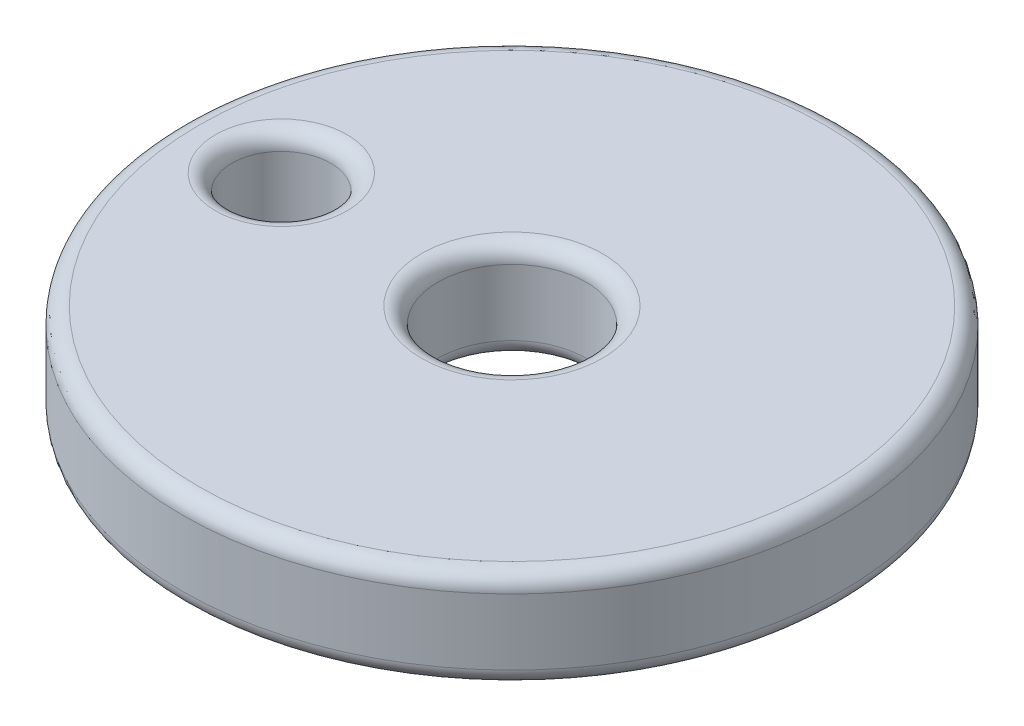
ISO-10303-21;
HEADER;
FILE_DESCRIPTION(('STEP AP214'),'2;1');
FILE_NAME('part.step','',(''),(''),'','','');
FILE_SCHEMA(('AUTOMOTIVE_DESIGN { 1 0 10303 214 1 1 1 1 }'));
ENDSEC;
DATA;
#1=APPLICATION_CONTEXT('core data for automotive mechanical design processes');
#2=APPLICATION_PROTOCOL_DEFINITION('international standard','automotive_design',2000,#1);
#3=PRODUCT_CONTEXT('',#1,'mechanical');
#4=PRODUCT('Part','Part','',(#3));
#5=PRODUCT_RELATED_PRODUCT_CATEGORY('part','',(#4));
#6=PRODUCT_DEFINITION_FORMATION('','',#4);
#7=PRODUCT_DEFINITION_CONTEXT('part definition',#1,'design');
#8=PRODUCT_DEFINITION('design','',#6,#7);
#9=PRODUCT_DEFINITION_SHAPE('','',#8);
#10=(LENGTH_UNIT() NAMED_UNIT(*) SI_UNIT(.MILLI.,.METRE.));
#11=(NAMED_UNIT(*) PLANE_ANGLE_UNIT() SI_UNIT($,.RADIAN.));
#12=(NAMED_UNIT(*) SI_UNIT($,.STERADIAN.) SOLID_ANGLE_UNIT());
#13=UNCERTAINTY_MEASURE_WITH_UNIT(LENGTH_MEASURE(1.E-05),#10,'distance_accuracy_value','');
#14=(GEOMETRIC_REPRESENTATION_CONTEXT(3) GLOBAL_UNCERTAINTY_ASSIGNED_CONTEXT((#13)) GLOBAL_UNIT_ASSIGNED_CONTEXT((#10,
#11,#12)) REPRESENTATION_CONTEXT('',''));
#15=CARTESIAN_POINT('',(0.,0.,0.));
#16=DIRECTION('',(0.,0.,1.));
#17=DIRECTION('',(1.,0.,0.));
#18=AXIS2_PLACEMENT_3D('',#15,#16,#17);
#19=CARTESIAN_POINT('',(0.,3.,0.));
#20=DIRECTION('',(0.,1.,0.));
#21=DIRECTION('',(0.,0.,1.));
#22=AXIS2_PLACEMENT_3D('',#19,#20,#21);
#23=PLANE('',#22);
#24=CARTESIAN_POINT('',(-7.,3.,0.));
#25=DIRECTION('',(0.,1.,0.));
#26=DIRECTION('',(0.,0.,1.));
#27=AXIS2_PLACEMENT_3D('',#24,#25,#26);
#28=CIRCLE('',#27,2.);
#29=CARTESIAN_POINT('',(-7.,3.,2.));
#30=VERTEX_POINT('',#29);
#31=EDGE_CURVE('E10',#30,#30,#28,.F.);
#32=ORIENTED_EDGE('',*,*,#31,.T.);
#33=EDGE_LOOP('',(#32));
#34=FACE_BOUND('',#33,.T.);
#35=CARTESIAN_POINT('',(0.,3.,0.));
#36=DIRECTION('',(0.,1.,0.));
#37=DIRECTION('',(0.,0.,1.));
#38=AXIS2_PLACEMENT_3D('',#35,#36,#37);
#39=CIRCLE('',#38,9.5);
#40=CARTESIAN_POINT('',(0.,3.,9.5));
#41=VERTEX_POINT('',#40);
#42=EDGE_CURVE('E38',#41,#41,#39,.T.);
#43=ORIENTED_EDGE('',*,*,#42,.T.);
#44=EDGE_LOOP('',(#43));
#45=FACE_BOUND('',#44,.T.);
#46=CARTESIAN_POINT('',(0.,3.,0.));
#47=DIRECTION('',(0.,1.,0.));
#48=DIRECTION('',(0.,0.,1.));
#49=AXIS2_PLACEMENT_3D('',#46,#47,#48);
#50=CIRCLE('',#49,2.75);
#51=CARTESIAN_POINT('',(0.,3.,2.75));
#52=VERTEX_POINT('',#51);
#53=EDGE_CURVE('E42',#52,#52,#50,.F.);
#54=ORIENTED_EDGE('',*,*,#53,.T.);
#55=EDGE_LOOP('',(#54));
#56=FACE_BOUND('',#55,.T.);
#57=ADVANCED_FACE('F31',(#34,#45,#56),#23,.T.);
#58=CARTESIAN_POINT('',(0.,0.,0.));
#59=DIRECTION('',(0.,1.,0.));
#60=DIRECTION('',(0.,0.,1.));
#61=AXIS2_PLACEMENT_3D('',#58,#59,#60);
#62=PLANE('',#61);
#63=CARTESIAN_POINT('',(-7.,0.,0.));
#64=DIRECTION('',(0.,1.,0.));
#65=DIRECTION('',(0.,0.,1.));
#66=AXIS2_PLACEMENT_3D('',#63,#64,#65);
#67=CIRCLE('',#66,2.);
#68=CARTESIAN_POINT('',(-7.,0.,2.));
#69=VERTEX_POINT('',#68);
#70=EDGE_CURVE('E66',#69,#69,#67,.T.);
#71=ORIENTED_EDGE('',*,*,#70,.T.);
#72=EDGE_LOOP('',(#71));
#73=FACE_BOUND('',#72,.T.);
#74=CARTESIAN_POINT('',(0.,0.,0.));
#75=DIRECTION('',(0.,1.,0.));
#76=DIRECTION('',(0.,0.,1.));
#77=AXIS2_PLACEMENT_3D('',#74,#75,#76);
#78=CIRCLE('',#77,2.75);
#79=CARTESIAN_POINT('',(0.,0.,2.75));
#80=VERTEX_POINT('',#79);
#81=EDGE_CURVE('E69',#80,#80,#78,.T.);
#82=ORIENTED_EDGE('',*,*,#81,.T.);
#83=EDGE_LOOP('',(#82));
#84=FACE_BOUND('',#83,.T.);
#85=CARTESIAN_POINT('',(0.,0.,0.));
#86=DIRECTION('',(0.,1.,0.));
#87=DIRECTION('',(0.,0.,1.));
#88=AXIS2_PLACEMENT_3D('',#85,#86,#87);
#89=CIRCLE('',#88,9.5);
#90=CARTESIAN_POINT('',(0.,0.,9.5));
#91=VERTEX_POINT('',#90);
#92=EDGE_CURVE('E72',#91,#91,#89,.F.);
#93=ORIENTED_EDGE('',*,*,#92,.T.);
#94=EDGE_LOOP('',(#93));
#95=FACE_BOUND('',#94,.T.);
#96=ADVANCED_FACE('F76',(#73,#84,#95),#62,.F.);
#97=CARTESIAN_POINT('',(0.,3.,0.));
#98=DIRECTION('',(0.,-1.,0.));
#99=DIRECTION('',(0.,0.,-1.));
#100=AXIS2_PLACEMENT_3D('',#97,#98,#99);
#101=CYLINDRICAL_SURFACE('',#100,10.);
#102=CARTESIAN_POINT('',(0.,0.5,0.));
#103=DIRECTION('',(0.,1.,0.));
#104=DIRECTION('',(0.,0.,1.));
#105=AXIS2_PLACEMENT_3D('',#102,#103,#104);
#106=CIRCLE('',#105,10.);
#107=CARTESIAN_POINT('',(0.,0.5,10.));
#108=VERTEX_POINT('',#107);
#109=EDGE_CURVE('E46',#108,#108,#106,.T.);
#110=ORIENTED_EDGE('',*,*,#109,.T.);
#111=EDGE_LOOP('',(#110));
#112=FACE_BOUND('',#111,.T.);
#113=CARTESIAN_POINT('',(0.,2.5,0.));
#114=DIRECTION('',(0.,1.,0.));
#115=DIRECTION('',(0.,0.,1.));
#116=AXIS2_PLACEMENT_3D('',#113,#114,#115);
#117=CIRCLE('',#116,10.);
#118=CARTESIAN_POINT('',(0.,2.5,10.));
#119=VERTEX_POINT('',#118);
#120=EDGE_CURVE('E51',#119,#119,#117,.F.);
#121=ORIENTED_EDGE('',*,*,#120,.T.);
#122=EDGE_LOOP('',(#121));
#123=FACE_BOUND('',#122,.T.);
#124=ADVANCED_FACE('F86',(#112,#123),#101,.T.);
#125=CARTESIAN_POINT('',(0.,3.,0.));
#126=DIRECTION('',(0.,-1.,0.));
#127=DIRECTION('',(0.,0.,-1.));
#128=AXIS2_PLACEMENT_3D('',#125,#126,#127);
#129=CYLINDRICAL_SURFACE('',#128,2.25);
#130=CARTESIAN_POINT('',(0.,0.5,0.));
#131=DIRECTION('',(0.,1.,0.));
#132=DIRECTION('',(0.,0.,1.));
#133=AXIS2_PLACEMENT_3D('',#130,#131,#132);
#134=CIRCLE('',#133,2.25);
#135=CARTESIAN_POINT('',(0.,0.5,2.25));
#136=VERTEX_POINT('',#135);
#137=EDGE_CURVE('E54',#136,#136,#134,.F.);
#138=ORIENTED_EDGE('',*,*,#137,.T.);
#139=EDGE_LOOP('',(#138));
#140=FACE_BOUND('',#139,.T.);
#141=CARTESIAN_POINT('',(0.,2.5,0.));
#142=DIRECTION('',(0.,1.,0.));
#143=DIRECTION('',(0.,0.,1.));
#144=AXIS2_PLACEMENT_3D('',#141,#142,#143);
#145=CIRCLE('',#144,2.25);
#146=CARTESIAN_POINT('',(0.,2.5,2.25));
#147=VERTEX_POINT('',#146);
#148=EDGE_CURVE('E57',#147,#147,#145,.T.);
#149=ORIENTED_EDGE('',*,*,#148,.T.);
#150=EDGE_LOOP('',(#149));
#151=FACE_BOUND('',#150,.T.);
#152=ADVANCED_FACE('F89',(#140,#151),#129,.F.);
#153=CARTESIAN_POINT('',(-7.,3.,0.));
#154=DIRECTION('',(0.,-1.,0.));
#155=DIRECTION('',(0.,0.,-1.));
#156=AXIS2_PLACEMENT_3D('',#153,#154,#155);
#157=CYLINDRICAL_SURFACE('',#156,1.5);
#158=CARTESIAN_POINT('',(-7.,0.5,0.));
#159=DIRECTION('',(0.,1.,0.));
#160=DIRECTION('',(0.,0.,1.));
#161=AXIS2_PLACEMENT_3D('',#158,#159,#160);
#162=CIRCLE('',#161,1.5);
#163=CARTESIAN_POINT('',(-7.,0.5,1.5));
#164=VERTEX_POINT('',#163);
#165=EDGE_CURVE('E60',#164,#164,#162,.F.);
#166=ORIENTED_EDGE('',*,*,#165,.T.);
#167=EDGE_LOOP('',(#166));
#168=FACE_BOUND('',#167,.T.);
#169=CARTESIAN_POINT('',(-7.,2.5,0.));
#170=DIRECTION('',(0.,1.,0.));
#171=DIRECTION('',(0.,0.,1.));
#172=AXIS2_PLACEMENT_3D('',#169,#170,#171);
#173=CIRCLE('',#172,1.5);
#174=CARTESIAN_POINT('',(-7.,2.5,1.5));
#175=VERTEX_POINT('',#174);
#176=EDGE_CURVE('E63',#175,#175,#173,.T.);
#177=ORIENTED_EDGE('',*,*,#176,.T.);
#178=EDGE_LOOP('',(#177));
#179=FACE_BOUND('',#178,.T.);
#180=ADVANCED_FACE('F116',(#168,#179),#157,.F.);
#181=CARTESIAN_POINT('',(-7.,0.5,0.));
#182=DIRECTION('',(0.,1.,0.));
#183=DIRECTION('',(0.,0.,1.));
#184=AXIS2_PLACEMENT_3D('',#181,#182,#183);
#185=TOROIDAL_SURFACE('',#184,2.,0.5);
#186=ORIENTED_EDGE('',*,*,#165,.F.);
#187=EDGE_LOOP('',(#186));
#188=FACE_BOUND('',#187,.T.);
#189=ORIENTED_EDGE('',*,*,#70,.F.);
#190=EDGE_LOOP('',(#189));
#191=FACE_BOUND('',#190,.T.);
#192=ADVANCED_FACE('F113',(#188,#191),#185,.T.);
#193=CARTESIAN_POINT('',(0.,0.5,0.));
#194=DIRECTION('',(0.,1.,0.));
#195=DIRECTION('',(0.,0.,1.));
#196=AXIS2_PLACEMENT_3D('',#193,#194,#195);
#197=TOROIDAL_SURFACE('',#196,2.75,0.5);
#198=ORIENTED_EDGE('',*,*,#137,.F.);
#199=EDGE_LOOP('',(#198));
#200=FACE_BOUND('',#199,.T.);
#201=ORIENTED_EDGE('',*,*,#81,.F.);
#202=EDGE_LOOP('',(#201));
#203=FACE_BOUND('',#202,.T.);
#204=ADVANCED_FACE('F82',(#200,#203),#197,.T.);
#205=CARTESIAN_POINT('',(0.,0.5,0.));
#206=DIRECTION('',(0.,1.,0.));
#207=DIRECTION('',(0.,0.,1.));
#208=AXIS2_PLACEMENT_3D('',#205,#206,#207);
#209=TOROIDAL_SURFACE('',#208,9.5,0.5);
#210=ORIENTED_EDGE('',*,*,#92,.F.);
#211=EDGE_LOOP('',(#210));
#212=FACE_BOUND('',#211,.T.);
#213=ORIENTED_EDGE('',*,*,#109,.F.);
#214=EDGE_LOOP('',(#213));
#215=FACE_BOUND('',#214,.T.);
#216=ADVANCED_FACE('F78',(#212,#215),#209,.T.);
#217=CARTESIAN_POINT('',(-7.,2.5,0.));
#218=DIRECTION('',(0.,1.,0.));
#219=DIRECTION('',(0.,0.,1.));
#220=AXIS2_PLACEMENT_3D('',#217,#218,#219);
#221=TOROIDAL_SURFACE('',#220,2.,0.5);
#222=ORIENTED_EDGE('',*,*,#31,.F.);
#223=EDGE_LOOP('',(#222));
#224=FACE_BOUND('',#223,.T.);
#225=ORIENTED_EDGE('',*,*,#176,.F.);
#226=EDGE_LOOP('',(#225));
#227=FACE_BOUND('',#226,.T.);
#228=ADVANCED_FACE('F81',(#224,#227),#221,.T.);
#229=CARTESIAN_POINT('',(0.,2.5,0.));
#230=DIRECTION('',(0.,1.,0.));
#231=DIRECTION('',(0.,0.,1.));
#232=AXIS2_PLACEMENT_3D('',#229,#230,#231);
#233=TOROIDAL_SURFACE('',#232,9.5,0.5);
#234=ORIENTED_EDGE('',*,*,#120,.F.);
#235=EDGE_LOOP('',(#234));
#236=FACE_BOUND('',#235,.T.);
#237=ORIENTED_EDGE('',*,*,#42,.F.);
#238=EDGE_LOOP('',(#237));
#239=FACE_BOUND('',#238,.T.);
#240=ADVANCED_FACE('F93',(#236,#239),#233,.T.);
#241=CARTESIAN_POINT('',(0.,2.5,0.));
#242=DIRECTION('',(0.,1.,0.));
#243=DIRECTION('',(0.,0.,1.));
#244=AXIS2_PLACEMENT_3D('',#241,#242,#243);
#245=TOROIDAL_SURFACE('',#244,2.75,0.5);
#246=ORIENTED_EDGE('',*,*,#53,.F.);
#247=EDGE_LOOP('',(#246));
#248=FACE_BOUND('',#247,.T.);
#249=ORIENTED_EDGE('',*,*,#148,.F.);
#250=EDGE_LOOP('',(#249));
#251=FACE_BOUND('',#250,.T.);
#252=ADVANCED_FACE('F33',(#248,#251),#245,.T.);
#253=CLOSED_SHELL('',(#57,#96,#124,#152,#180,#192,#204,#216,#228,#240,#252));
#254=MANIFOLD_SOLID_BREP('B2',#253);
#255=ADVANCED_BREP_SHAPE_REPRESENTATION('',(#18,#254),#14);
#256=SHAPE_DEFINITION_REPRESENTATION(#9,#255);
ENDSEC;
END-ISO-10303-21;
